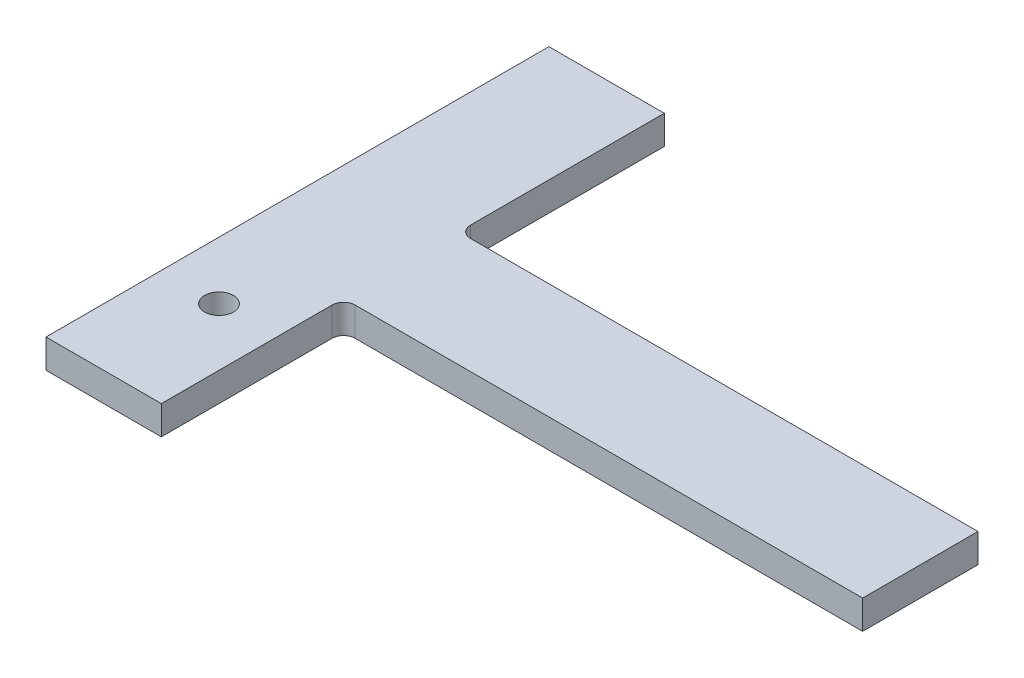
ISO-10303-21;
HEADER;
FILE_DESCRIPTION(('STEP AP214'),'2;1');
FILE_NAME('part.step','',(''),(''),'','','');
FILE_SCHEMA(('AUTOMOTIVE_DESIGN { 1 0 10303 214 1 1 1 1 }'));
ENDSEC;
DATA;
#1=APPLICATION_CONTEXT('core data for automotive mechanical design processes');
#2=APPLICATION_PROTOCOL_DEFINITION('international standard','automotive_design',2000,#1);
#3=PRODUCT_CONTEXT('',#1,'mechanical');
#4=PRODUCT('Part','Part','',(#3));
#5=PRODUCT_RELATED_PRODUCT_CATEGORY('part','',(#4));
#6=PRODUCT_DEFINITION_FORMATION('','',#4);
#7=PRODUCT_DEFINITION_CONTEXT('part definition',#1,'design');
#8=PRODUCT_DEFINITION('design','',#6,#7);
#9=PRODUCT_DEFINITION_SHAPE('','',#8);
#10=(LENGTH_UNIT() NAMED_UNIT(*) SI_UNIT(.MILLI.,.METRE.));
#11=(NAMED_UNIT(*) PLANE_ANGLE_UNIT() SI_UNIT($,.RADIAN.));
#12=(NAMED_UNIT(*) SI_UNIT($,.STERADIAN.) SOLID_ANGLE_UNIT());
#13=UNCERTAINTY_MEASURE_WITH_UNIT(LENGTH_MEASURE(1.E-05),#10,'distance_accuracy_value','');
#14=(GEOMETRIC_REPRESENTATION_CONTEXT(3) GLOBAL_UNCERTAINTY_ASSIGNED_CONTEXT((#13)) GLOBAL_UNIT_ASSIGNED_CONTEXT((#10,
#11,#12)) REPRESENTATION_CONTEXT('',''));
#15=CARTESIAN_POINT('',(0.,0.,0.));
#16=DIRECTION('',(0.,0.,1.));
#17=DIRECTION('',(1.,0.,0.));
#18=AXIS2_PLACEMENT_3D('',#15,#16,#17);
#19=CARTESIAN_POINT('',(0.,6.35,0.));
#20=DIRECTION('',(0.,1.,0.));
#21=DIRECTION('',(0.,0.,1.));
#22=AXIS2_PLACEMENT_3D('',#19,#20,#21);
#23=PLANE('',#22);
#24=DIRECTION('',(0.,0.,1.));
#25=VECTOR('',#24,1.);
#26=CARTESIAN_POINT('',(-42.0254545454546,6.35,-72.0667272727273));
#27=LINE('',#26,#25);
#28=CARTESIAN_POINT('',(-42.0254545454546,6.35,-72.0667272727273));
#29=VERTEX_POINT('',#28);
#30=CARTESIAN_POINT('',(-42.0254545454545,6.35,38.6772727272727));
#31=VERTEX_POINT('',#30);
#32=EDGE_CURVE('E136',#29,#31,#27,.T.);
#33=ORIENTED_EDGE('',*,*,#32,.T.);
#34=DIRECTION('',(1.,0.,0.));
#35=VECTOR('',#34,1.);
#36=CARTESIAN_POINT('',(-42.0254545454545,6.35,38.6772727272727));
#37=LINE('',#36,#35);
#38=CARTESIAN_POINT('',(-16.6254545454545,6.35,38.6772727272727));
#39=VERTEX_POINT('',#38);
#40=EDGE_CURVE('E123',#31,#39,#37,.T.);
#41=ORIENTED_EDGE('',*,*,#40,.T.);
#42=DIRECTION('',(0.,0.,-1.));
#43=VECTOR('',#42,1.);
#44=CARTESIAN_POINT('',(-16.6254545454546,6.35,-1.45472727272726));
#45=LINE('',#44,#43);
#46=CARTESIAN_POINT('',(-16.6254545454546,6.35,1.08527272727274));
#47=VERTEX_POINT('',#46);
#48=EDGE_CURVE('E135',#39,#47,#45,.T.);
#49=ORIENTED_EDGE('',*,*,#48,.T.);
#50=CARTESIAN_POINT('',(-14.0854545454545,6.35,1.08527272727274));
#51=DIRECTION('',(0.,1.,0.));
#52=DIRECTION('',(0.,0.,1.));
#53=AXIS2_PLACEMENT_3D('',#50,#51,#52);
#54=CIRCLE('',#53,2.54);
#55=CARTESIAN_POINT('',(-14.0854545454545,6.35,-1.45472727272726));
#56=VERTEX_POINT('',#55);
#57=EDGE_CURVE('E174',#47,#56,#54,.F.);
#58=ORIENTED_EDGE('',*,*,#57,.T.);
#59=DIRECTION('',(1.,0.,0.));
#60=VECTOR('',#59,1.);
#61=CARTESIAN_POINT('',(-16.6254545454546,6.35,-1.45472727272726));
#62=LINE('',#61,#60);
#63=CARTESIAN_POINT('',(97.6745454545455,6.35,-1.45472727272726));
#64=VERTEX_POINT('',#63);
#65=EDGE_CURVE('E179',#56,#64,#62,.T.);
#66=ORIENTED_EDGE('',*,*,#65,.T.);
#67=DIRECTION('',(0.,0.,-1.));
#68=VECTOR('',#67,1.);
#69=CARTESIAN_POINT('',(97.6745454545454,6.35,-26.8547272727273));
#70=LINE('',#69,#68);
#71=CARTESIAN_POINT('',(97.6745454545454,6.35,-26.8547272727273));
#72=VERTEX_POINT('',#71);
#73=EDGE_CURVE('E190',#64,#72,#70,.T.);
#74=ORIENTED_EDGE('',*,*,#73,.T.);
#75=DIRECTION('',(-1.,0.,0.));
#76=VECTOR('',#75,1.);
#77=CARTESIAN_POINT('',(-16.6254545454546,6.35,-26.8547272727273));
#78=LINE('',#77,#76);
#79=CARTESIAN_POINT('',(-14.0854545454546,6.35,-26.8547272727273));
#80=VERTEX_POINT('',#79);
#81=EDGE_CURVE('E243',#72,#80,#78,.T.);
#82=ORIENTED_EDGE('',*,*,#81,.T.);
#83=CARTESIAN_POINT('',(-14.0854545454546,6.35,-29.3947272727273));
#84=DIRECTION('',(0.,1.,0.));
#85=DIRECTION('',(0.,0.,1.));
#86=AXIS2_PLACEMENT_3D('',#83,#84,#85);
#87=CIRCLE('',#86,2.54);
#88=CARTESIAN_POINT('',(-16.6254545454546,6.35,-29.3947272727273));
#89=VERTEX_POINT('',#88);
#90=EDGE_CURVE('E11',#80,#89,#87,.F.);
#91=ORIENTED_EDGE('',*,*,#90,.T.);
#92=DIRECTION('',(0.,0.,-1.));
#93=VECTOR('',#92,1.);
#94=CARTESIAN_POINT('',(-16.6254545454546,6.35,-72.0667272727273));
#95=LINE('',#94,#93);
#96=CARTESIAN_POINT('',(-16.6254545454546,6.35,-72.0667272727273));
#97=VERTEX_POINT('',#96);
#98=EDGE_CURVE('E241',#89,#97,#95,.T.);
#99=ORIENTED_EDGE('',*,*,#98,.T.);
#100=DIRECTION('',(-1.,0.,0.));
#101=VECTOR('',#100,1.);
#102=CARTESIAN_POINT('',(-42.0254545454546,6.35,-72.0667272727273));
#103=LINE('',#102,#101);
#104=EDGE_CURVE('E141',#97,#29,#103,.T.);
#105=ORIENTED_EDGE('',*,*,#104,.T.);
#106=EDGE_LOOP('',(#33,#41,#49,#58,#66,#74,#82,#91,#99,#105));
#107=FACE_BOUND('',#106,.T.);
#108=CARTESIAN_POINT('',(-29.3254545454546,6.35,13.2772727272727));
#109=DIRECTION('',(0.,1.,0.));
#110=DIRECTION('',(0.,0.,1.));
#111=AXIS2_PLACEMENT_3D('',#108,#109,#110);
#112=CIRCLE('',#111,3.175);
#113=CARTESIAN_POINT('',(-29.3254545454546,6.35,16.4522727272727));
#114=VERTEX_POINT('',#113);
#115=EDGE_CURVE('E254',#114,#114,#112,.T.);
#116=ORIENTED_EDGE('',*,*,#115,.F.);
#117=EDGE_LOOP('',(#116));
#118=FACE_BOUND('',#117,.T.);
#119=ADVANCED_FACE('F45',(#107,#118),#23,.T.);
#120=CARTESIAN_POINT('',(0.,0.,0.));
#121=DIRECTION('',(0.,1.,0.));
#122=DIRECTION('',(0.,0.,1.));
#123=AXIS2_PLACEMENT_3D('',#120,#121,#122);
#124=PLANE('',#123);
#125=DIRECTION('',(0.,0.,1.));
#126=VECTOR('',#125,1.);
#127=CARTESIAN_POINT('',(-42.0254545454546,0.,-72.0667272727273));
#128=LINE('',#127,#126);
#129=CARTESIAN_POINT('',(-42.0254545454546,0.,-72.0667272727273));
#130=VERTEX_POINT('',#129);
#131=CARTESIAN_POINT('',(-42.0254545454545,0.,38.6772727272727));
#132=VERTEX_POINT('',#131);
#133=EDGE_CURVE('E150',#130,#132,#128,.T.);
#134=ORIENTED_EDGE('',*,*,#133,.F.);
#135=DIRECTION('',(-1.,0.,0.));
#136=VECTOR('',#135,1.);
#137=CARTESIAN_POINT('',(-42.0254545454546,0.,-72.0667272727273));
#138=LINE('',#137,#136);
#139=CARTESIAN_POINT('',(-16.6254545454546,0.,-72.0667272727273));
#140=VERTEX_POINT('',#139);
#141=EDGE_CURVE('E146',#140,#130,#138,.T.);
#142=ORIENTED_EDGE('',*,*,#141,.F.);
#143=DIRECTION('',(0.,0.,-1.));
#144=VECTOR('',#143,1.);
#145=CARTESIAN_POINT('',(-16.6254545454546,0.,-72.0667272727273));
#146=LINE('',#145,#144);
#147=CARTESIAN_POINT('',(-16.6254545454546,0.,-29.3947272727273));
#148=VERTEX_POINT('',#147);
#149=EDGE_CURVE('E217',#148,#140,#146,.T.);
#150=ORIENTED_EDGE('',*,*,#149,.F.);
#151=CARTESIAN_POINT('',(-14.0854545454546,0.,-29.3947272727273));
#152=DIRECTION('',(0.,1.,0.));
#153=DIRECTION('',(0.,0.,1.));
#154=AXIS2_PLACEMENT_3D('',#151,#152,#153);
#155=CIRCLE('',#154,2.54);
#156=CARTESIAN_POINT('',(-14.0854545454546,0.,-26.8547272727273));
#157=VERTEX_POINT('',#156);
#158=EDGE_CURVE('E54',#148,#157,#155,.T.);
#159=ORIENTED_EDGE('',*,*,#158,.T.);
#160=DIRECTION('',(-1.,0.,0.));
#161=VECTOR('',#160,1.);
#162=CARTESIAN_POINT('',(-16.6254545454546,0.,-26.8547272727273));
#163=LINE('',#162,#161);
#164=CARTESIAN_POINT('',(97.6745454545454,0.,-26.8547272727273));
#165=VERTEX_POINT('',#164);
#166=EDGE_CURVE('E214',#165,#157,#163,.T.);
#167=ORIENTED_EDGE('',*,*,#166,.F.);
#168=DIRECTION('',(0.,0.,-1.));
#169=VECTOR('',#168,1.);
#170=CARTESIAN_POINT('',(97.6745454545454,0.,-26.8547272727273));
#171=LINE('',#170,#169);
#172=CARTESIAN_POINT('',(97.6745454545455,0.,-1.45472727272726));
#173=VERTEX_POINT('',#172);
#174=EDGE_CURVE('E207',#173,#165,#171,.T.);
#175=ORIENTED_EDGE('',*,*,#174,.F.);
#176=DIRECTION('',(1.,0.,0.));
#177=VECTOR('',#176,1.);
#178=CARTESIAN_POINT('',(-16.6254545454546,0.,-1.45472727272726));
#179=LINE('',#178,#177);
#180=CARTESIAN_POINT('',(-14.0854545454545,0.,-1.45472727272726));
#181=VERTEX_POINT('',#180);
#182=EDGE_CURVE('E199',#181,#173,#179,.T.);
#183=ORIENTED_EDGE('',*,*,#182,.F.);
#184=CARTESIAN_POINT('',(-14.0854545454545,0.,1.08527272727274));
#185=DIRECTION('',(0.,1.,0.));
#186=DIRECTION('',(0.,0.,1.));
#187=AXIS2_PLACEMENT_3D('',#184,#185,#186);
#188=CIRCLE('',#187,2.54);
#189=CARTESIAN_POINT('',(-16.6254545454546,0.,1.08527272727274));
#190=VERTEX_POINT('',#189);
#191=EDGE_CURVE('E171',#181,#190,#188,.T.);
#192=ORIENTED_EDGE('',*,*,#191,.T.);
#193=DIRECTION('',(0.,0.,-1.));
#194=VECTOR('',#193,1.);
#195=CARTESIAN_POINT('',(-16.6254545454546,0.,-1.45472727272726));
#196=LINE('',#195,#194);
#197=CARTESIAN_POINT('',(-16.6254545454545,0.,38.6772727272727));
#198=VERTEX_POINT('',#197);
#199=EDGE_CURVE('E197',#198,#190,#196,.T.);
#200=ORIENTED_EDGE('',*,*,#199,.F.);
#201=DIRECTION('',(1.,0.,0.));
#202=VECTOR('',#201,1.);
#203=CARTESIAN_POINT('',(-42.0254545454545,0.,38.6772727272727));
#204=LINE('',#203,#202);
#205=EDGE_CURVE('E203',#132,#198,#204,.T.);
#206=ORIENTED_EDGE('',*,*,#205,.F.);
#207=EDGE_LOOP('',(#134,#142,#150,#159,#167,#175,#183,#192,#200,#206));
#208=FACE_BOUND('',#207,.T.);
#209=CARTESIAN_POINT('',(-29.3254545454546,0.,13.2772727272727));
#210=DIRECTION('',(0.,1.,0.));
#211=DIRECTION('',(0.,0.,1.));
#212=AXIS2_PLACEMENT_3D('',#209,#210,#211);
#213=CIRCLE('',#212,3.175);
#214=CARTESIAN_POINT('',(-29.3254545454546,0.,16.4522727272727));
#215=VERTEX_POINT('',#214);
#216=EDGE_CURVE('E257',#215,#215,#213,.T.);
#217=ORIENTED_EDGE('',*,*,#216,.T.);
#218=EDGE_LOOP('',(#217));
#219=FACE_BOUND('',#218,.T.);
#220=ADVANCED_FACE('F195',(#208,#219),#124,.F.);
#221=CARTESIAN_POINT('',(-42.0254545454546,6.35,-72.0667272727273));
#222=DIRECTION('',(1.,0.,0.));
#223=DIRECTION('',(0.,0.,-1.));
#224=AXIS2_PLACEMENT_3D('',#221,#222,#223);
#225=PLANE('',#224);
#226=ORIENTED_EDGE('',*,*,#133,.T.);
#227=DIRECTION('',(0.,-1.,0.));
#228=VECTOR('',#227,1.);
#229=CARTESIAN_POINT('',(-42.0254545454545,6.35,38.6772727272727));
#230=LINE('',#229,#228);
#231=EDGE_CURVE('E127',#31,#132,#230,.T.);
#232=ORIENTED_EDGE('',*,*,#231,.F.);
#233=ORIENTED_EDGE('',*,*,#32,.F.);
#234=DIRECTION('',(0.,-1.,0.));
#235=VECTOR('',#234,1.);
#236=CARTESIAN_POINT('',(-42.0254545454546,6.35,-72.0667272727273));
#237=LINE('',#236,#235);
#238=EDGE_CURVE('E222',#29,#130,#237,.T.);
#239=ORIENTED_EDGE('',*,*,#238,.T.);
#240=EDGE_LOOP('',(#226,#232,#233,#239));
#241=FACE_BOUND('',#240,.T.);
#242=ADVANCED_FACE('F148',(#241),#225,.F.);
#243=CARTESIAN_POINT('',(-42.0254545454545,6.35,38.6772727272727));
#244=DIRECTION('',(0.,0.,-1.));
#245=DIRECTION('',(-1.,0.,0.));
#246=AXIS2_PLACEMENT_3D('',#243,#244,#245);
#247=PLANE('',#246);
#248=ORIENTED_EDGE('',*,*,#205,.T.);
#249=DIRECTION('',(0.,-1.,0.));
#250=VECTOR('',#249,1.);
#251=CARTESIAN_POINT('',(-16.6254545454545,6.35,38.6772727272727));
#252=LINE('',#251,#250);
#253=EDGE_CURVE('E130',#39,#198,#252,.T.);
#254=ORIENTED_EDGE('',*,*,#253,.F.);
#255=ORIENTED_EDGE('',*,*,#40,.F.);
#256=ORIENTED_EDGE('',*,*,#231,.T.);
#257=EDGE_LOOP('',(#248,#254,#255,#256));
#258=FACE_BOUND('',#257,.T.);
#259=ADVANCED_FACE('F125',(#258),#247,.F.);
#260=CARTESIAN_POINT('',(-16.6254545454546,6.35,-1.45472727272726));
#261=DIRECTION('',(-1.,0.,0.));
#262=DIRECTION('',(0.,0.,1.));
#263=AXIS2_PLACEMENT_3D('',#260,#261,#262);
#264=PLANE('',#263);
#265=ORIENTED_EDGE('',*,*,#199,.T.);
#266=DIRECTION('',(0.,-1.,0.));
#267=VECTOR('',#266,1.);
#268=CARTESIAN_POINT('',(-16.6254545454546,6.35,1.08527272727274));
#269=LINE('',#268,#267);
#270=EDGE_CURVE('E157',#190,#47,#269,.F.);
#271=ORIENTED_EDGE('',*,*,#270,.T.);
#272=ORIENTED_EDGE('',*,*,#48,.F.);
#273=ORIENTED_EDGE('',*,*,#253,.T.);
#274=EDGE_LOOP('',(#265,#271,#272,#273));
#275=FACE_BOUND('',#274,.T.);
#276=ADVANCED_FACE('F201',(#275),#264,.F.);
#277=CARTESIAN_POINT('',(-16.6254545454546,6.35,-1.45472727272726));
#278=DIRECTION('',(0.,0.,-1.));
#279=DIRECTION('',(-1.,0.,0.));
#280=AXIS2_PLACEMENT_3D('',#277,#278,#279);
#281=PLANE('',#280);
#282=ORIENTED_EDGE('',*,*,#65,.F.);
#283=DIRECTION('',(0.,-1.,0.));
#284=VECTOR('',#283,1.);
#285=CARTESIAN_POINT('',(-14.0854545454545,0.,-1.45472727272726));
#286=LINE('',#285,#284);
#287=EDGE_CURVE('E152',#56,#181,#286,.T.);
#288=ORIENTED_EDGE('',*,*,#287,.T.);
#289=ORIENTED_EDGE('',*,*,#182,.T.);
#290=DIRECTION('',(0.,-1.,0.));
#291=VECTOR('',#290,1.);
#292=CARTESIAN_POINT('',(97.6745454545455,6.35,-1.45472727272726));
#293=LINE('',#292,#291);
#294=EDGE_CURVE('E159',#64,#173,#293,.T.);
#295=ORIENTED_EDGE('',*,*,#294,.F.);
#296=EDGE_LOOP('',(#282,#288,#289,#295));
#297=FACE_BOUND('',#296,.T.);
#298=ADVANCED_FACE('F185',(#297),#281,.F.);
#299=CARTESIAN_POINT('',(97.6745454545454,6.35,-26.8547272727273));
#300=DIRECTION('',(-1.,0.,0.));
#301=DIRECTION('',(0.,0.,1.));
#302=AXIS2_PLACEMENT_3D('',#299,#300,#301);
#303=PLANE('',#302);
#304=ORIENTED_EDGE('',*,*,#174,.T.);
#305=DIRECTION('',(0.,-1.,0.));
#306=VECTOR('',#305,1.);
#307=CARTESIAN_POINT('',(97.6745454545454,6.35,-26.8547272727273));
#308=LINE('',#307,#306);
#309=EDGE_CURVE('E229',#72,#165,#308,.T.);
#310=ORIENTED_EDGE('',*,*,#309,.F.);
#311=ORIENTED_EDGE('',*,*,#73,.F.);
#312=ORIENTED_EDGE('',*,*,#294,.T.);
#313=EDGE_LOOP('',(#304,#310,#311,#312));
#314=FACE_BOUND('',#313,.T.);
#315=ADVANCED_FACE('F234',(#314),#303,.F.);
#316=CARTESIAN_POINT('',(-16.6254545454546,6.35,-26.8547272727273));
#317=DIRECTION('',(0.,0.,1.));
#318=DIRECTION('',(1.,0.,0.));
#319=AXIS2_PLACEMENT_3D('',#316,#317,#318);
#320=PLANE('',#319);
#321=ORIENTED_EDGE('',*,*,#166,.T.);
#322=DIRECTION('',(0.,-1.,0.));
#323=VECTOR('',#322,1.);
#324=CARTESIAN_POINT('',(-14.0854545454546,6.35,-26.8547272727273));
#325=LINE('',#324,#323);
#326=EDGE_CURVE('E61',#157,#80,#325,.F.);
#327=ORIENTED_EDGE('',*,*,#326,.T.);
#328=ORIENTED_EDGE('',*,*,#81,.F.);
#329=ORIENTED_EDGE('',*,*,#309,.T.);
#330=EDGE_LOOP('',(#321,#327,#328,#329));
#331=FACE_BOUND('',#330,.T.);
#332=ADVANCED_FACE('F236',(#331),#320,.F.);
#333=CARTESIAN_POINT('',(-16.6254545454546,6.35,-72.0667272727273));
#334=DIRECTION('',(-1.,0.,0.));
#335=DIRECTION('',(0.,0.,1.));
#336=AXIS2_PLACEMENT_3D('',#333,#334,#335);
#337=PLANE('',#336);
#338=ORIENTED_EDGE('',*,*,#98,.F.);
#339=DIRECTION('',(0.,-1.,0.));
#340=VECTOR('',#339,1.);
#341=CARTESIAN_POINT('',(-16.6254545454546,0.,-29.3947272727273));
#342=LINE('',#341,#340);
#343=EDGE_CURVE('E165',#89,#148,#342,.T.);
#344=ORIENTED_EDGE('',*,*,#343,.T.);
#345=ORIENTED_EDGE('',*,*,#149,.T.);
#346=DIRECTION('',(0.,-1.,0.));
#347=VECTOR('',#346,1.);
#348=CARTESIAN_POINT('',(-16.6254545454546,6.35,-72.0667272727273));
#349=LINE('',#348,#347);
#350=EDGE_CURVE('E225',#97,#140,#349,.T.);
#351=ORIENTED_EDGE('',*,*,#350,.F.);
#352=EDGE_LOOP('',(#338,#344,#345,#351));
#353=FACE_BOUND('',#352,.T.);
#354=ADVANCED_FACE('F245',(#353),#337,.F.);
#355=CARTESIAN_POINT('',(-42.0254545454546,6.35,-72.0667272727273));
#356=DIRECTION('',(0.,0.,1.));
#357=DIRECTION('',(1.,0.,0.));
#358=AXIS2_PLACEMENT_3D('',#355,#356,#357);
#359=PLANE('',#358);
#360=ORIENTED_EDGE('',*,*,#141,.T.);
#361=ORIENTED_EDGE('',*,*,#238,.F.);
#362=ORIENTED_EDGE('',*,*,#104,.F.);
#363=ORIENTED_EDGE('',*,*,#350,.T.);
#364=EDGE_LOOP('',(#360,#361,#362,#363));
#365=FACE_BOUND('',#364,.T.);
#366=ADVANCED_FACE('F271',(#365),#359,.F.);
#367=CARTESIAN_POINT('',(-29.3254545454546,6.35,13.2772727272727));
#368=DIRECTION('',(0.,-1.,0.));
#369=DIRECTION('',(0.,0.,-1.));
#370=AXIS2_PLACEMENT_3D('',#367,#368,#369);
#371=CYLINDRICAL_SURFACE('',#370,3.175);
#372=ORIENTED_EDGE('',*,*,#115,.T.);
#373=EDGE_LOOP('',(#372));
#374=FACE_BOUND('',#373,.T.);
#375=ORIENTED_EDGE('',*,*,#216,.F.);
#376=EDGE_LOOP('',(#375));
#377=FACE_BOUND('',#376,.T.);
#378=ADVANCED_FACE('F269',(#374,#377),#371,.F.);
#379=CARTESIAN_POINT('',(-14.0854545454545,6.35,1.08527272727274));
#380=DIRECTION('',(0.,1.,0.));
#381=DIRECTION('',(0.,0.,1.));
#382=AXIS2_PLACEMENT_3D('',#379,#380,#381);
#383=CYLINDRICAL_SURFACE('',#382,2.54);
#384=ORIENTED_EDGE('',*,*,#57,.F.);
#385=ORIENTED_EDGE('',*,*,#270,.F.);
#386=ORIENTED_EDGE('',*,*,#191,.F.);
#387=ORIENTED_EDGE('',*,*,#287,.F.);
#388=EDGE_LOOP('',(#384,#385,#386,#387));
#389=FACE_BOUND('',#388,.T.);
#390=ADVANCED_FACE('F192',(#389),#383,.F.);
#391=CARTESIAN_POINT('',(-14.0854545454546,6.35,-29.3947272727273));
#392=DIRECTION('',(0.,1.,0.));
#393=DIRECTION('',(0.,0.,1.));
#394=AXIS2_PLACEMENT_3D('',#391,#392,#393);
#395=CYLINDRICAL_SURFACE('',#394,2.54);
#396=ORIENTED_EDGE('',*,*,#90,.F.);
#397=ORIENTED_EDGE('',*,*,#326,.F.);
#398=ORIENTED_EDGE('',*,*,#158,.F.);
#399=ORIENTED_EDGE('',*,*,#343,.F.);
#400=EDGE_LOOP('',(#396,#397,#398,#399));
#401=FACE_BOUND('',#400,.T.);
#402=ADVANCED_FACE('F47',(#401),#395,.F.);
#403=CLOSED_SHELL('',(#119,#220,#242,#259,#276,#298,#315,#332,#354,#366,#378,#390,#402));
#404=MANIFOLD_SOLID_BREP('B2',#403);
#405=ADVANCED_BREP_SHAPE_REPRESENTATION('',(#18,#404),#14);
#406=SHAPE_DEFINITION_REPRESENTATION(#9,#405);
ENDSEC;
END-ISO-10303-21;
